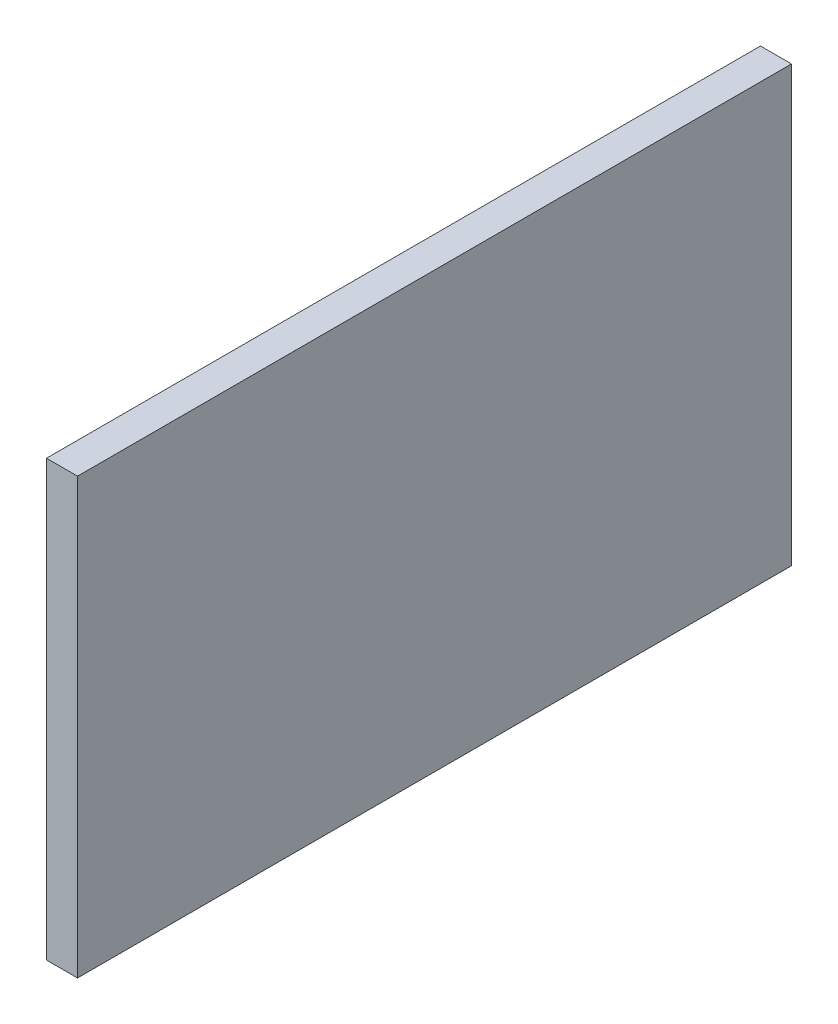
ISO-10303-21;
HEADER;
FILE_DESCRIPTION(('STEP AP214'),'2;1');
FILE_NAME('part.step','',(''),(''),'','','');
FILE_SCHEMA(('AUTOMOTIVE_DESIGN { 1 0 10303 214 1 1 1 1 }'));
ENDSEC;
DATA;
#1=APPLICATION_CONTEXT('core data for automotive mechanical design processes');
#2=APPLICATION_PROTOCOL_DEFINITION('international standard','automotive_design',2000,#1);
#3=PRODUCT_CONTEXT('',#1,'mechanical');
#4=PRODUCT('Part','Part','',(#3));
#5=PRODUCT_RELATED_PRODUCT_CATEGORY('part','',(#4));
#6=PRODUCT_DEFINITION_FORMATION('','',#4);
#7=PRODUCT_DEFINITION_CONTEXT('part definition',#1,'design');
#8=PRODUCT_DEFINITION('design','',#6,#7);
#9=PRODUCT_DEFINITION_SHAPE('','',#8);
#10=(LENGTH_UNIT() NAMED_UNIT(*) SI_UNIT(.MILLI.,.METRE.));
#11=(NAMED_UNIT(*) PLANE_ANGLE_UNIT() SI_UNIT($,.RADIAN.));
#12=(NAMED_UNIT(*) SI_UNIT($,.STERADIAN.) SOLID_ANGLE_UNIT());
#13=UNCERTAINTY_MEASURE_WITH_UNIT(LENGTH_MEASURE(1.E-05),#10,'distance_accuracy_value','');
#14=(GEOMETRIC_REPRESENTATION_CONTEXT(3) GLOBAL_UNCERTAINTY_ASSIGNED_CONTEXT((#13)) GLOBAL_UNIT_ASSIGNED_CONTEXT((#10,
#11,#12)) REPRESENTATION_CONTEXT('',''));
#15=CARTESIAN_POINT('',(0.,0.,0.));
#16=DIRECTION('',(0.,0.,1.));
#17=DIRECTION('',(1.,0.,0.));
#18=AXIS2_PLACEMENT_3D('',#15,#16,#17);
#19=CARTESIAN_POINT('',(3.,-21.,34.5));
#20=DIRECTION('',(0.,0.,-1.));
#21=DIRECTION('',(-1.,0.,0.));
#22=AXIS2_PLACEMENT_3D('',#19,#20,#21);
#23=PLANE('',#22);
#24=DIRECTION('',(0.,-1.,0.));
#25=VECTOR('',#24,1.);
#26=CARTESIAN_POINT('',(0.,-21.,34.5));
#27=LINE('',#26,#25);
#28=CARTESIAN_POINT('',(0.,21.,34.5));
#29=VERTEX_POINT('',#28);
#30=CARTESIAN_POINT('',(0.,-21.,34.5));
#31=VERTEX_POINT('',#30);
#32=EDGE_CURVE('E107',#29,#31,#27,.T.);
#33=ORIENTED_EDGE('',*,*,#32,.T.);
#34=DIRECTION('',(-1.,0.,0.));
#35=VECTOR('',#34,1.);
#36=CARTESIAN_POINT('',(3.,-21.,34.5));
#37=LINE('',#36,#35);
#38=CARTESIAN_POINT('',(3.,-21.,34.5));
#39=VERTEX_POINT('',#38);
#40=EDGE_CURVE('E11',#39,#31,#37,.T.);
#41=ORIENTED_EDGE('',*,*,#40,.F.);
#42=DIRECTION('',(0.,-1.,0.));
#43=VECTOR('',#42,1.);
#44=CARTESIAN_POINT('',(3.,-21.,34.5));
#45=LINE('',#44,#43);
#46=CARTESIAN_POINT('',(3.,21.,34.5));
#47=VERTEX_POINT('',#46);
#48=EDGE_CURVE('E91',#47,#39,#45,.T.);
#49=ORIENTED_EDGE('',*,*,#48,.F.);
#50=DIRECTION('',(-1.,0.,0.));
#51=VECTOR('',#50,1.);
#52=CARTESIAN_POINT('',(3.,21.,34.5));
#53=LINE('',#52,#51);
#54=EDGE_CURVE('E103',#47,#29,#53,.T.);
#55=ORIENTED_EDGE('',*,*,#54,.T.);
#56=EDGE_LOOP('',(#33,#41,#49,#55));
#57=FACE_BOUND('',#56,.T.);
#58=ADVANCED_FACE('F39',(#57),#23,.F.);
#59=CARTESIAN_POINT('',(3.,-21.,-34.5));
#60=DIRECTION('',(0.,1.,0.));
#61=DIRECTION('',(0.,0.,1.));
#62=AXIS2_PLACEMENT_3D('',#59,#60,#61);
#63=PLANE('',#62);
#64=DIRECTION('',(0.,0.,-1.));
#65=VECTOR('',#64,1.);
#66=CARTESIAN_POINT('',(0.,-21.,-34.5));
#67=LINE('',#66,#65);
#68=CARTESIAN_POINT('',(0.,-21.,-34.5));
#69=VERTEX_POINT('',#68);
#70=EDGE_CURVE('E96',#31,#69,#67,.T.);
#71=ORIENTED_EDGE('',*,*,#70,.T.);
#72=DIRECTION('',(-1.,0.,0.));
#73=VECTOR('',#72,1.);
#74=CARTESIAN_POINT('',(3.,-21.,-34.5));
#75=LINE('',#74,#73);
#76=CARTESIAN_POINT('',(3.,-21.,-34.5));
#77=VERTEX_POINT('',#76);
#78=EDGE_CURVE('E48',#77,#69,#75,.T.);
#79=ORIENTED_EDGE('',*,*,#78,.F.);
#80=DIRECTION('',(0.,0.,-1.));
#81=VECTOR('',#80,1.);
#82=CARTESIAN_POINT('',(3.,-21.,-34.5));
#83=LINE('',#82,#81);
#84=EDGE_CURVE('E86',#39,#77,#83,.T.);
#85=ORIENTED_EDGE('',*,*,#84,.F.);
#86=ORIENTED_EDGE('',*,*,#40,.T.);
#87=EDGE_LOOP('',(#71,#79,#85,#86));
#88=FACE_BOUND('',#87,.T.);
#89=ADVANCED_FACE('F95',(#88),#63,.F.);
#90=CARTESIAN_POINT('',(3.,-21.,-34.5));
#91=DIRECTION('',(0.,0.,1.));
#92=DIRECTION('',(1.,0.,0.));
#93=AXIS2_PLACEMENT_3D('',#90,#91,#92);
#94=PLANE('',#93);
#95=DIRECTION('',(0.,1.,0.));
#96=VECTOR('',#95,1.);
#97=CARTESIAN_POINT('',(0.,-21.,-34.5));
#98=LINE('',#97,#96);
#99=CARTESIAN_POINT('',(0.,21.,-34.5));
#100=VERTEX_POINT('',#99);
#101=EDGE_CURVE('E73',#69,#100,#98,.T.);
#102=ORIENTED_EDGE('',*,*,#101,.T.);
#103=DIRECTION('',(-1.,0.,0.));
#104=VECTOR('',#103,1.);
#105=CARTESIAN_POINT('',(3.,21.,-34.5));
#106=LINE('',#105,#104);
#107=CARTESIAN_POINT('',(3.,21.,-34.5));
#108=VERTEX_POINT('',#107);
#109=EDGE_CURVE('E98',#108,#100,#106,.T.);
#110=ORIENTED_EDGE('',*,*,#109,.F.);
#111=DIRECTION('',(0.,1.,0.));
#112=VECTOR('',#111,1.);
#113=CARTESIAN_POINT('',(3.,-21.,-34.5));
#114=LINE('',#113,#112);
#115=EDGE_CURVE('E89',#77,#108,#114,.T.);
#116=ORIENTED_EDGE('',*,*,#115,.F.);
#117=ORIENTED_EDGE('',*,*,#78,.T.);
#118=EDGE_LOOP('',(#102,#110,#116,#117));
#119=FACE_BOUND('',#118,.T.);
#120=ADVANCED_FACE('F99',(#119),#94,.F.);
#121=CARTESIAN_POINT('',(3.,21.,-34.5));
#122=DIRECTION('',(0.,-1.,0.));
#123=DIRECTION('',(0.,0.,-1.));
#124=AXIS2_PLACEMENT_3D('',#121,#122,#123);
#125=PLANE('',#124);
#126=DIRECTION('',(0.,0.,1.));
#127=VECTOR('',#126,1.);
#128=CARTESIAN_POINT('',(0.,21.,-34.5));
#129=LINE('',#128,#127);
#130=EDGE_CURVE('E79',#100,#29,#129,.T.);
#131=ORIENTED_EDGE('',*,*,#130,.T.);
#132=ORIENTED_EDGE('',*,*,#54,.F.);
#133=DIRECTION('',(0.,0.,1.));
#134=VECTOR('',#133,1.);
#135=CARTESIAN_POINT('',(3.,21.,-34.5));
#136=LINE('',#135,#134);
#137=EDGE_CURVE('E56',#108,#47,#136,.T.);
#138=ORIENTED_EDGE('',*,*,#137,.F.);
#139=ORIENTED_EDGE('',*,*,#109,.T.);
#140=EDGE_LOOP('',(#131,#132,#138,#139));
#141=FACE_BOUND('',#140,.T.);
#142=ADVANCED_FACE('F120',(#141),#125,.F.);
#143=CARTESIAN_POINT('',(3.,0.,0.));
#144=DIRECTION('',(1.,0.,0.));
#145=DIRECTION('',(0.,0.,-1.));
#146=AXIS2_PLACEMENT_3D('',#143,#144,#145);
#147=PLANE('',#146);
#148=ORIENTED_EDGE('',*,*,#48,.T.);
#149=ORIENTED_EDGE('',*,*,#84,.T.);
#150=ORIENTED_EDGE('',*,*,#115,.T.);
#151=ORIENTED_EDGE('',*,*,#137,.T.);
#152=EDGE_LOOP('',(#148,#149,#150,#151));
#153=FACE_BOUND('',#152,.T.);
#154=ADVANCED_FACE('F87',(#153),#147,.T.);
#155=CARTESIAN_POINT('',(0.,0.,0.));
#156=DIRECTION('',(1.,0.,0.));
#157=DIRECTION('',(0.,0.,-1.));
#158=AXIS2_PLACEMENT_3D('',#155,#156,#157);
#159=PLANE('',#158);
#160=ORIENTED_EDGE('',*,*,#32,.F.);
#161=ORIENTED_EDGE('',*,*,#130,.F.);
#162=ORIENTED_EDGE('',*,*,#101,.F.);
#163=ORIENTED_EDGE('',*,*,#70,.F.);
#164=EDGE_LOOP('',(#160,#161,#162,#163));
#165=FACE_BOUND('',#164,.T.);
#166=ADVANCED_FACE('F123',(#165),#159,.F.);
#167=CLOSED_SHELL('',(#58,#89,#120,#142,#154,#166));
#168=MANIFOLD_SOLID_BREP('B2',#167);
#169=ADVANCED_BREP_SHAPE_REPRESENTATION('',(#18,#168),#14);
#170=SHAPE_DEFINITION_REPRESENTATION(#9,#169);
ENDSEC;
END-ISO-10303-21;
